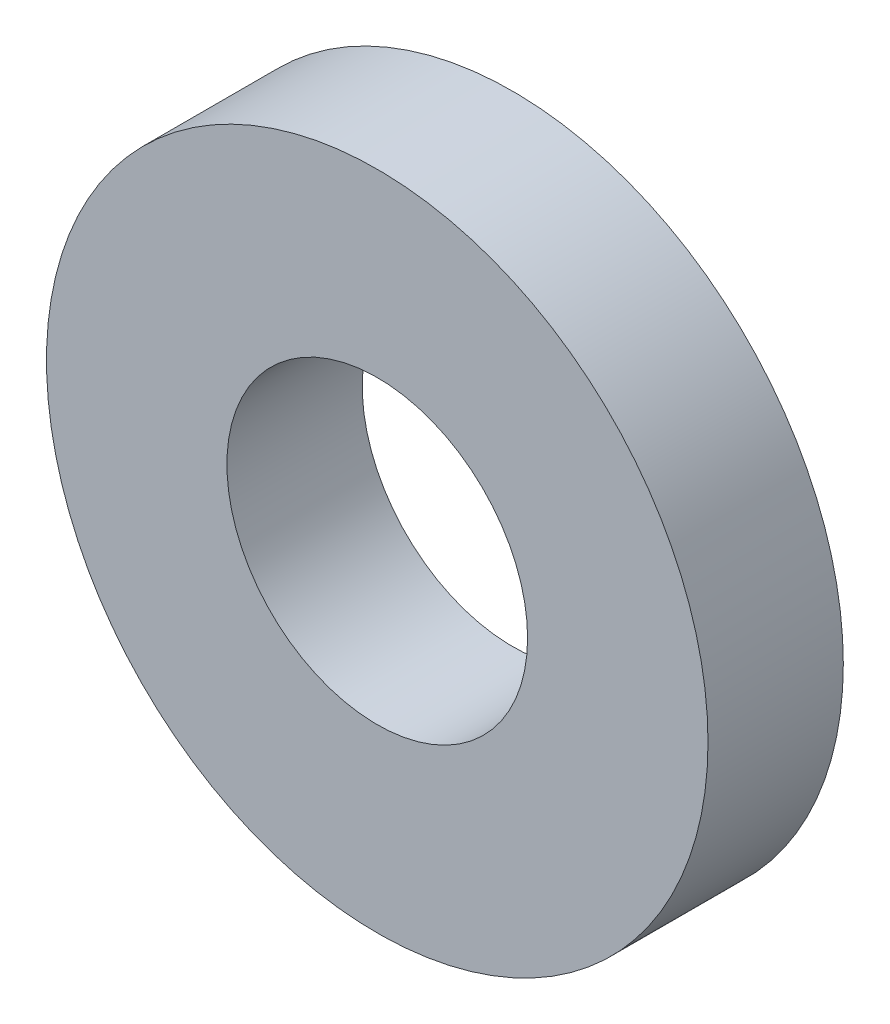
ISO-10303-21;
HEADER;
FILE_DESCRIPTION(('STEP AP214'),'2;1');
FILE_NAME('part.step','',(''),(''),'','','');
FILE_SCHEMA(('AUTOMOTIVE_DESIGN { 1 0 10303 214 1 1 1 1 }'));
ENDSEC;
DATA;
#1=APPLICATION_CONTEXT('core data for automotive mechanical design processes');
#2=APPLICATION_PROTOCOL_DEFINITION('international standard','automotive_design',2000,#1);
#3=PRODUCT_CONTEXT('',#1,'mechanical');
#4=PRODUCT('Part','Part','',(#3));
#5=PRODUCT_RELATED_PRODUCT_CATEGORY('part','',(#4));
#6=PRODUCT_DEFINITION_FORMATION('','',#4);
#7=PRODUCT_DEFINITION_CONTEXT('part definition',#1,'design');
#8=PRODUCT_DEFINITION('design','',#6,#7);
#9=PRODUCT_DEFINITION_SHAPE('','',#8);
#10=(LENGTH_UNIT() NAMED_UNIT(*) SI_UNIT(.MILLI.,.METRE.));
#11=(NAMED_UNIT(*) PLANE_ANGLE_UNIT() SI_UNIT($,.RADIAN.));
#12=(NAMED_UNIT(*) SI_UNIT($,.STERADIAN.) SOLID_ANGLE_UNIT());
#13=UNCERTAINTY_MEASURE_WITH_UNIT(LENGTH_MEASURE(1.E-05),#10,'distance_accuracy_value','');
#14=(GEOMETRIC_REPRESENTATION_CONTEXT(3) GLOBAL_UNCERTAINTY_ASSIGNED_CONTEXT((#13)) GLOBAL_UNIT_ASSIGNED_CONTEXT((#10,
#11,#12)) REPRESENTATION_CONTEXT('',''));
#15=CARTESIAN_POINT('',(0.,0.,0.));
#16=DIRECTION('',(0.,0.,1.));
#17=DIRECTION('',(1.,0.,0.));
#18=AXIS2_PLACEMENT_3D('',#15,#16,#17);
#19=CARTESIAN_POINT('',(0.,0.,2.25));
#20=DIRECTION('',(0.,0.,1.));
#21=DIRECTION('',(1.,0.,0.));
#22=AXIS2_PLACEMENT_3D('',#19,#20,#21);
#23=PLANE('',#22);
#24=CARTESIAN_POINT('',(0.,0.,2.25));
#25=DIRECTION('',(0.,0.,1.));
#26=DIRECTION('',(1.,0.,0.));
#27=AXIS2_PLACEMENT_3D('',#24,#25,#26);
#28=CIRCLE('',#27,11.);
#29=CARTESIAN_POINT('',(11.,0.,2.25));
#30=VERTEX_POINT('',#29);
#31=EDGE_CURVE('E10',#30,#30,#28,.T.);
#32=ORIENTED_EDGE('',*,*,#31,.T.);
#33=EDGE_LOOP('',(#32));
#34=FACE_BOUND('',#33,.T.);
#35=CARTESIAN_POINT('',(0.,0.,2.25));
#36=DIRECTION('',(0.,0.,1.));
#37=DIRECTION('',(1.,0.,0.));
#38=AXIS2_PLACEMENT_3D('',#35,#36,#37);
#39=CIRCLE('',#38,5.);
#40=CARTESIAN_POINT('',(5.,0.,2.25));
#41=VERTEX_POINT('',#40);
#42=EDGE_CURVE('E46',#41,#41,#39,.T.);
#43=ORIENTED_EDGE('',*,*,#42,.F.);
#44=EDGE_LOOP('',(#43));
#45=FACE_BOUND('',#44,.T.);
#46=ADVANCED_FACE('F35',(#34,#45),#23,.T.);
#47=CARTESIAN_POINT('',(0.,0.,-2.25));
#48=DIRECTION('',(0.,0.,1.));
#49=DIRECTION('',(1.,0.,0.));
#50=AXIS2_PLACEMENT_3D('',#47,#48,#49);
#51=PLANE('',#50);
#52=CARTESIAN_POINT('',(0.,0.,-2.25));
#53=DIRECTION('',(0.,0.,1.));
#54=DIRECTION('',(1.,0.,0.));
#55=AXIS2_PLACEMENT_3D('',#52,#53,#54);
#56=CIRCLE('',#55,11.);
#57=CARTESIAN_POINT('',(11.,0.,-2.25));
#58=VERTEX_POINT('',#57);
#59=EDGE_CURVE('E39',#58,#58,#56,.T.);
#60=ORIENTED_EDGE('',*,*,#59,.F.);
#61=EDGE_LOOP('',(#60));
#62=FACE_BOUND('',#61,.T.);
#63=CARTESIAN_POINT('',(0.,0.,-2.25));
#64=DIRECTION('',(0.,0.,1.));
#65=DIRECTION('',(1.,0.,0.));
#66=AXIS2_PLACEMENT_3D('',#63,#64,#65);
#67=CIRCLE('',#66,5.);
#68=CARTESIAN_POINT('',(5.,0.,-2.25));
#69=VERTEX_POINT('',#68);
#70=EDGE_CURVE('E48',#69,#69,#67,.T.);
#71=ORIENTED_EDGE('',*,*,#70,.T.);
#72=EDGE_LOOP('',(#71));
#73=FACE_BOUND('',#72,.T.);
#74=ADVANCED_FACE('F58',(#62,#73),#51,.F.);
#75=CARTESIAN_POINT('',(0.,0.,2.25));
#76=DIRECTION('',(0.,0.,-1.));
#77=DIRECTION('',(-1.,0.,0.));
#78=AXIS2_PLACEMENT_3D('',#75,#76,#77);
#79=CYLINDRICAL_SURFACE('',#78,11.);
#80=ORIENTED_EDGE('',*,*,#31,.F.);
#81=EDGE_LOOP('',(#80));
#82=FACE_BOUND('',#81,.T.);
#83=ORIENTED_EDGE('',*,*,#59,.T.);
#84=EDGE_LOOP('',(#83));
#85=FACE_BOUND('',#84,.T.);
#86=ADVANCED_FACE('F37',(#82,#85),#79,.T.);
#87=CARTESIAN_POINT('',(0.,0.,2.25));
#88=DIRECTION('',(0.,0.,-1.));
#89=DIRECTION('',(-1.,0.,0.));
#90=AXIS2_PLACEMENT_3D('',#87,#88,#89);
#91=CYLINDRICAL_SURFACE('',#90,5.);
#92=ORIENTED_EDGE('',*,*,#42,.T.);
#93=EDGE_LOOP('',(#92));
#94=FACE_BOUND('',#93,.T.);
#95=ORIENTED_EDGE('',*,*,#70,.F.);
#96=EDGE_LOOP('',(#95));
#97=FACE_BOUND('',#96,.T.);
#98=ADVANCED_FACE('F54',(#94,#97),#91,.F.);
#99=CLOSED_SHELL('',(#46,#74,#86,#98));
#100=MANIFOLD_SOLID_BREP('B2',#99);
#101=ADVANCED_BREP_SHAPE_REPRESENTATION('',(#18,#100),#14);
#102=SHAPE_DEFINITION_REPRESENTATION(#9,#101);
ENDSEC;
END-ISO-10303-21;
